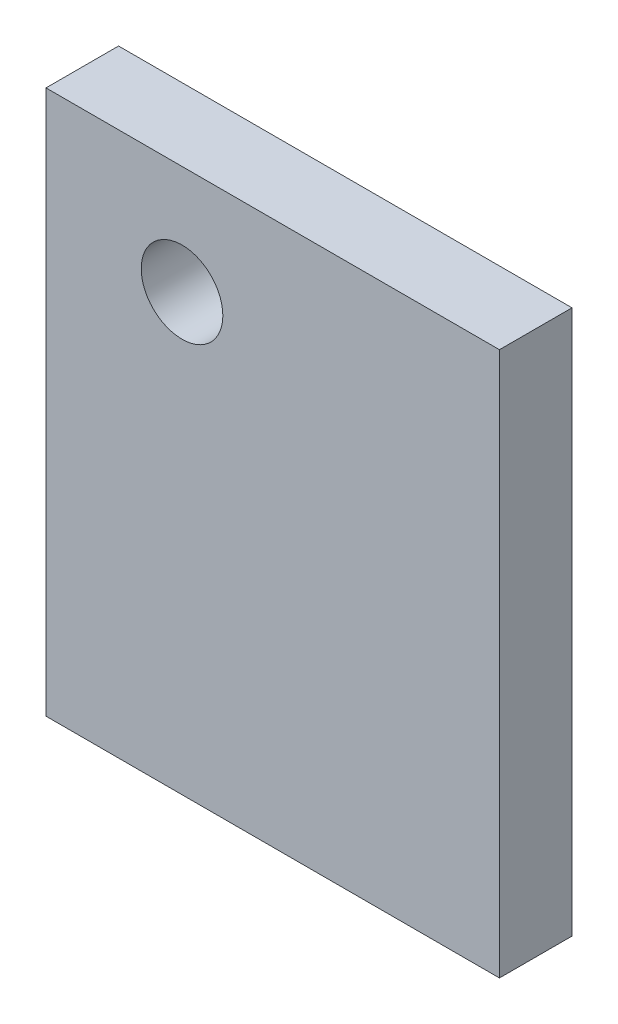
ISO-10303-21;
HEADER;
FILE_DESCRIPTION(('STEP AP214'),'2;1');
FILE_NAME('part.step','',(''),(''),'','','');
FILE_SCHEMA(('AUTOMOTIVE_DESIGN { 1 0 10303 214 1 1 1 1 }'));
ENDSEC;
DATA;
#1=APPLICATION_CONTEXT('core data for automotive mechanical design processes');
#2=APPLICATION_PROTOCOL_DEFINITION('international standard','automotive_design',2000,#1);
#3=PRODUCT_CONTEXT('',#1,'mechanical');
#4=PRODUCT('Part','Part','',(#3));
#5=PRODUCT_RELATED_PRODUCT_CATEGORY('part','',(#4));
#6=PRODUCT_DEFINITION_FORMATION('','',#4);
#7=PRODUCT_DEFINITION_CONTEXT('part definition',#1,'design');
#8=PRODUCT_DEFINITION('design','',#6,#7);
#9=PRODUCT_DEFINITION_SHAPE('','',#8);
#10=(LENGTH_UNIT() NAMED_UNIT(*) SI_UNIT(.MILLI.,.METRE.));
#11=(NAMED_UNIT(*) PLANE_ANGLE_UNIT() SI_UNIT($,.RADIAN.));
#12=(NAMED_UNIT(*) SI_UNIT($,.STERADIAN.) SOLID_ANGLE_UNIT());
#13=UNCERTAINTY_MEASURE_WITH_UNIT(LENGTH_MEASURE(1.E-05),#10,'distance_accuracy_value','');
#14=(GEOMETRIC_REPRESENTATION_CONTEXT(3) GLOBAL_UNCERTAINTY_ASSIGNED_CONTEXT((#13)) GLOBAL_UNIT_ASSIGNED_CONTEXT((#10,
#11,#12)) REPRESENTATION_CONTEXT('',''));
#15=CARTESIAN_POINT('',(0.,0.,0.));
#16=DIRECTION('',(0.,0.,1.));
#17=DIRECTION('',(1.,0.,0.));
#18=AXIS2_PLACEMENT_3D('',#15,#16,#17);
#19=CARTESIAN_POINT('',(0.,0.,8.));
#20=DIRECTION('',(0.,0.,-1.));
#21=DIRECTION('',(-1.,0.,0.));
#22=AXIS2_PLACEMENT_3D('',#19,#20,#21);
#23=PLANE('',#22);
#24=DIRECTION('',(0.,1.,0.));
#25=VECTOR('',#24,1.);
#26=CARTESIAN_POINT('',(25.,-30.,8.));
#27=LINE('',#26,#25);
#28=CARTESIAN_POINT('',(25.,-30.,8.));
#29=VERTEX_POINT('',#28);
#30=CARTESIAN_POINT('',(25.,30.,8.));
#31=VERTEX_POINT('',#30);
#32=EDGE_CURVE('E85',#29,#31,#27,.T.);
#33=ORIENTED_EDGE('',*,*,#32,.T.);
#34=DIRECTION('',(-1.,0.,0.));
#35=VECTOR('',#34,1.);
#36=CARTESIAN_POINT('',(-25.,30.,8.));
#37=LINE('',#36,#35);
#38=CARTESIAN_POINT('',(-25.,30.,8.));
#39=VERTEX_POINT('',#38);
#40=EDGE_CURVE('E80',#31,#39,#37,.T.);
#41=ORIENTED_EDGE('',*,*,#40,.T.);
#42=DIRECTION('',(0.,-1.,0.));
#43=VECTOR('',#42,1.);
#44=CARTESIAN_POINT('',(-25.,-30.,8.));
#45=LINE('',#44,#43);
#46=CARTESIAN_POINT('',(-25.,-30.,8.));
#47=VERTEX_POINT('',#46);
#48=EDGE_CURVE('E83',#39,#47,#45,.T.);
#49=ORIENTED_EDGE('',*,*,#48,.T.);
#50=DIRECTION('',(1.,0.,0.));
#51=VECTOR('',#50,1.);
#52=CARTESIAN_POINT('',(-25.,-30.,8.));
#53=LINE('',#52,#51);
#54=EDGE_CURVE('E50',#47,#29,#53,.T.);
#55=ORIENTED_EDGE('',*,*,#54,.T.);
#56=EDGE_LOOP('',(#33,#41,#49,#55));
#57=FACE_BOUND('',#56,.T.);
#58=CARTESIAN_POINT('',(-10.,18.,8.));
#59=DIRECTION('',(0.,0.,1.));
#60=DIRECTION('',(1.,0.,0.));
#61=AXIS2_PLACEMENT_3D('',#58,#59,#60);
#62=CIRCLE('',#61,4.5);
#63=CARTESIAN_POINT('',(-5.50000000000001,18.,8.));
#64=VERTEX_POINT('',#63);
#65=EDGE_CURVE('E100',#64,#64,#62,.T.);
#66=ORIENTED_EDGE('',*,*,#65,.F.);
#67=EDGE_LOOP('',(#66));
#68=FACE_BOUND('',#67,.T.);
#69=ADVANCED_FACE('F33',(#57,#68),#23,.F.);
#70=CARTESIAN_POINT('',(0.,0.,0.));
#71=DIRECTION('',(0.,0.,-1.));
#72=DIRECTION('',(-1.,0.,0.));
#73=AXIS2_PLACEMENT_3D('',#70,#71,#72);
#74=PLANE('',#73);
#75=DIRECTION('',(0.,1.,0.));
#76=VECTOR('',#75,1.);
#77=CARTESIAN_POINT('',(25.,-30.,0.));
#78=LINE('',#77,#76);
#79=CARTESIAN_POINT('',(25.,-30.,0.));
#80=VERTEX_POINT('',#79);
#81=CARTESIAN_POINT('',(25.,30.,0.));
#82=VERTEX_POINT('',#81);
#83=EDGE_CURVE('E97',#80,#82,#78,.T.);
#84=ORIENTED_EDGE('',*,*,#83,.F.);
#85=DIRECTION('',(1.,0.,0.));
#86=VECTOR('',#85,1.);
#87=CARTESIAN_POINT('',(-25.,-30.,0.));
#88=LINE('',#87,#86);
#89=CARTESIAN_POINT('',(-25.,-30.,0.));
#90=VERTEX_POINT('',#89);
#91=EDGE_CURVE('E73',#90,#80,#88,.T.);
#92=ORIENTED_EDGE('',*,*,#91,.F.);
#93=DIRECTION('',(0.,-1.,0.));
#94=VECTOR('',#93,1.);
#95=CARTESIAN_POINT('',(-25.,-30.,0.));
#96=LINE('',#95,#94);
#97=CARTESIAN_POINT('',(-25.,30.,0.));
#98=VERTEX_POINT('',#97);
#99=EDGE_CURVE('E67',#98,#90,#96,.T.);
#100=ORIENTED_EDGE('',*,*,#99,.F.);
#101=DIRECTION('',(-1.,0.,0.));
#102=VECTOR('',#101,1.);
#103=CARTESIAN_POINT('',(-25.,30.,0.));
#104=LINE('',#103,#102);
#105=EDGE_CURVE('E89',#82,#98,#104,.T.);
#106=ORIENTED_EDGE('',*,*,#105,.F.);
#107=EDGE_LOOP('',(#84,#92,#100,#106));
#108=FACE_BOUND('',#107,.T.);
#109=CARTESIAN_POINT('',(-10.,18.,0.));
#110=DIRECTION('',(0.,0.,1.));
#111=DIRECTION('',(1.,0.,0.));
#112=AXIS2_PLACEMENT_3D('',#109,#110,#111);
#113=CIRCLE('',#112,4.5);
#114=CARTESIAN_POINT('',(-5.50000000000001,18.,0.));
#115=VERTEX_POINT('',#114);
#116=EDGE_CURVE('E112',#115,#115,#113,.T.);
#117=ORIENTED_EDGE('',*,*,#116,.T.);
#118=EDGE_LOOP('',(#117));
#119=FACE_BOUND('',#118,.T.);
#120=ADVANCED_FACE('F108',(#108,#119),#74,.T.);
#121=CARTESIAN_POINT('',(25.,-30.,8.));
#122=DIRECTION('',(-1.,0.,0.));
#123=DIRECTION('',(0.,0.,1.));
#124=AXIS2_PLACEMENT_3D('',#121,#122,#123);
#125=PLANE('',#124);
#126=ORIENTED_EDGE('',*,*,#83,.T.);
#127=DIRECTION('',(0.,0.,-1.));
#128=VECTOR('',#127,1.);
#129=CARTESIAN_POINT('',(25.,30.,8.));
#130=LINE('',#129,#128);
#131=EDGE_CURVE('E11',#31,#82,#130,.T.);
#132=ORIENTED_EDGE('',*,*,#131,.F.);
#133=ORIENTED_EDGE('',*,*,#32,.F.);
#134=DIRECTION('',(0.,0.,-1.));
#135=VECTOR('',#134,1.);
#136=CARTESIAN_POINT('',(25.,-30.,8.));
#137=LINE('',#136,#135);
#138=EDGE_CURVE('E93',#29,#80,#137,.T.);
#139=ORIENTED_EDGE('',*,*,#138,.T.);
#140=EDGE_LOOP('',(#126,#132,#133,#139));
#141=FACE_BOUND('',#140,.T.);
#142=ADVANCED_FACE('F35',(#141),#125,.F.);
#143=CARTESIAN_POINT('',(-25.,30.,8.));
#144=DIRECTION('',(0.,-1.,0.));
#145=DIRECTION('',(0.,0.,-1.));
#146=AXIS2_PLACEMENT_3D('',#143,#144,#145);
#147=PLANE('',#146);
#148=ORIENTED_EDGE('',*,*,#105,.T.);
#149=DIRECTION('',(0.,0.,-1.));
#150=VECTOR('',#149,1.);
#151=CARTESIAN_POINT('',(-25.,30.,8.));
#152=LINE('',#151,#150);
#153=EDGE_CURVE('E42',#39,#98,#152,.T.);
#154=ORIENTED_EDGE('',*,*,#153,.F.);
#155=ORIENTED_EDGE('',*,*,#40,.F.);
#156=ORIENTED_EDGE('',*,*,#131,.T.);
#157=EDGE_LOOP('',(#148,#154,#155,#156));
#158=FACE_BOUND('',#157,.T.);
#159=ADVANCED_FACE('F88',(#158),#147,.F.);
#160=CARTESIAN_POINT('',(-25.,-30.,8.));
#161=DIRECTION('',(1.,0.,0.));
#162=DIRECTION('',(0.,0.,-1.));
#163=AXIS2_PLACEMENT_3D('',#160,#161,#162);
#164=PLANE('',#163);
#165=ORIENTED_EDGE('',*,*,#99,.T.);
#166=DIRECTION('',(0.,0.,-1.));
#167=VECTOR('',#166,1.);
#168=CARTESIAN_POINT('',(-25.,-30.,8.));
#169=LINE('',#168,#167);
#170=EDGE_CURVE('E90',#47,#90,#169,.T.);
#171=ORIENTED_EDGE('',*,*,#170,.F.);
#172=ORIENTED_EDGE('',*,*,#48,.F.);
#173=ORIENTED_EDGE('',*,*,#153,.T.);
#174=EDGE_LOOP('',(#165,#171,#172,#173));
#175=FACE_BOUND('',#174,.T.);
#176=ADVANCED_FACE('F91',(#175),#164,.F.);
#177=CARTESIAN_POINT('',(-25.,-30.,8.));
#178=DIRECTION('',(0.,1.,0.));
#179=DIRECTION('',(0.,0.,1.));
#180=AXIS2_PLACEMENT_3D('',#177,#178,#179);
#181=PLANE('',#180);
#182=ORIENTED_EDGE('',*,*,#91,.T.);
#183=ORIENTED_EDGE('',*,*,#138,.F.);
#184=ORIENTED_EDGE('',*,*,#54,.F.);
#185=ORIENTED_EDGE('',*,*,#170,.T.);
#186=EDGE_LOOP('',(#182,#183,#184,#185));
#187=FACE_BOUND('',#186,.T.);
#188=ADVANCED_FACE('F105',(#187),#181,.F.);
#189=CARTESIAN_POINT('',(-10.,18.,8.));
#190=DIRECTION('',(0.,0.,-1.));
#191=DIRECTION('',(-1.,0.,0.));
#192=AXIS2_PLACEMENT_3D('',#189,#190,#191);
#193=CYLINDRICAL_SURFACE('',#192,4.5);
#194=ORIENTED_EDGE('',*,*,#65,.T.);
#195=EDGE_LOOP('',(#194));
#196=FACE_BOUND('',#195,.T.);
#197=ORIENTED_EDGE('',*,*,#116,.F.);
#198=EDGE_LOOP('',(#197));
#199=FACE_BOUND('',#198,.T.);
#200=ADVANCED_FACE('F118',(#196,#199),#193,.F.);
#201=CLOSED_SHELL('',(#69,#120,#142,#159,#176,#188,#200));
#202=MANIFOLD_SOLID_BREP('B2',#201);
#203=ADVANCED_BREP_SHAPE_REPRESENTATION('',(#18,#202),#14);
#204=SHAPE_DEFINITION_REPRESENTATION(#9,#203);
ENDSEC;
END-ISO-10303-21;
